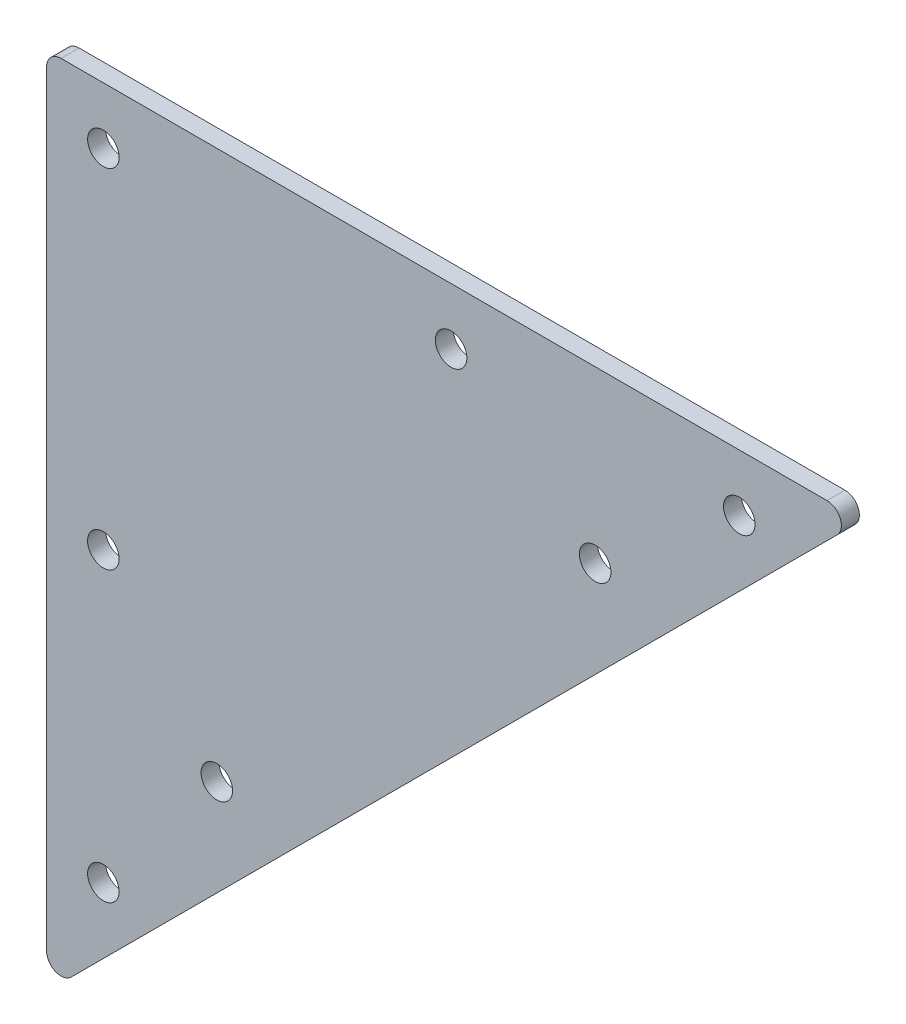
ISO-10303-21;
HEADER;
FILE_DESCRIPTION(('STEP AP214'),'2;1');
FILE_NAME('part.step','',(''),(''),'','','');
FILE_SCHEMA(('AUTOMOTIVE_DESIGN { 1 0 10303 214 1 1 1 1 }'));
ENDSEC;
DATA;
#1=APPLICATION_CONTEXT('core data for automotive mechanical design processes');
#2=APPLICATION_PROTOCOL_DEFINITION('international standard','automotive_design',2000,#1);
#3=PRODUCT_CONTEXT('',#1,'mechanical');
#4=PRODUCT('Part','Part','',(#3));
#5=PRODUCT_RELATED_PRODUCT_CATEGORY('part','',(#4));
#6=PRODUCT_DEFINITION_FORMATION('','',#4);
#7=PRODUCT_DEFINITION_CONTEXT('part definition',#1,'design');
#8=PRODUCT_DEFINITION('design','',#6,#7);
#9=PRODUCT_DEFINITION_SHAPE('','',#8);
#10=(LENGTH_UNIT() NAMED_UNIT(*) SI_UNIT(.MILLI.,.METRE.));
#11=(NAMED_UNIT(*) PLANE_ANGLE_UNIT() SI_UNIT($,.RADIAN.));
#12=(NAMED_UNIT(*) SI_UNIT($,.STERADIAN.) SOLID_ANGLE_UNIT());
#13=UNCERTAINTY_MEASURE_WITH_UNIT(LENGTH_MEASURE(1.E-05),#10,'distance_accuracy_value','');
#14=(GEOMETRIC_REPRESENTATION_CONTEXT(3) GLOBAL_UNCERTAINTY_ASSIGNED_CONTEXT((#13)) GLOBAL_UNIT_ASSIGNED_CONTEXT((#10,
#11,#12)) REPRESENTATION_CONTEXT('',''));
#15=CARTESIAN_POINT('',(0.,0.,0.));
#16=DIRECTION('',(0.,0.,1.));
#17=DIRECTION('',(1.,0.,0.));
#18=AXIS2_PLACEMENT_3D('',#15,#16,#17);
#19=CARTESIAN_POINT('',(-69.3020489685536,69.3020489685527,0.));
#20=DIRECTION('',(0.,0.,1.));
#21=DIRECTION('',(0.,-1.,0.));
#22=AXIS2_PLACEMENT_3D('',#19,#20,#21);
#23=PLANE('',#22);
#24=CARTESIAN_POINT('',(-41.8420489685458,-24.8520489685689,0.));
#25=DIRECTION('',(0.,0.,-1.));
#26=DIRECTION('',(0.,1.,0.));
#27=AXIS2_PLACEMENT_3D('',#24,#25,#26);
#28=CIRCLE('',#27,2.77876);
#29=CARTESIAN_POINT('',(-41.8420489685458,-22.0732889685689,0.));
#30=VERTEX_POINT('',#29);
#31=EDGE_CURVE('E161',#30,#30,#28,.F.);
#32=ORIENTED_EDGE('',*,*,#31,.T.);
#33=EDGE_LOOP('',(#32));
#34=FACE_BOUND('',#33,.T.);
#35=CARTESIAN_POINT('',(-61.8420489685541,0.547951031431015,0.));
#36=DIRECTION('',(0.,0.,-1.));
#37=DIRECTION('',(0.,1.,0.));
#38=AXIS2_PLACEMENT_3D('',#35,#36,#37);
#39=CIRCLE('',#38,2.77875999999999);
#40=CARTESIAN_POINT('',(-61.8420489685541,3.32671103143101,0.));
#41=VERTEX_POINT('',#40);
#42=EDGE_CURVE('E20',#41,#41,#39,.F.);
#43=ORIENTED_EDGE('',*,*,#42,.T.);
#44=EDGE_LOOP('',(#43));
#45=FACE_BOUND('',#44,.T.);
#46=CARTESIAN_POINT('',(24.852048968554,41.8420489685454,0.));
#47=DIRECTION('',(0.,0.,-1.));
#48=DIRECTION('',(0.,1.,0.));
#49=AXIS2_PLACEMENT_3D('',#46,#47,#48);
#50=CIRCLE('',#49,2.77876);
#51=CARTESIAN_POINT('',(24.852048968554,44.6208089685454,0.));
#52=VERTEX_POINT('',#51);
#53=EDGE_CURVE('E165',#52,#52,#50,.F.);
#54=ORIENTED_EDGE('',*,*,#53,.T.);
#55=EDGE_LOOP('',(#54));
#56=FACE_BOUND('',#55,.T.);
#57=CARTESIAN_POINT('',(-0.547951031445892,61.8420489685529,0.));
#58=DIRECTION('',(0.,0.,-1.));
#59=DIRECTION('',(0.,1.,0.));
#60=AXIS2_PLACEMENT_3D('',#57,#58,#59);
#61=CIRCLE('',#60,2.77876);
#62=CARTESIAN_POINT('',(-0.547951031445892,64.620808968553,0.));
#63=VERTEX_POINT('',#62);
#64=EDGE_CURVE('E180',#63,#63,#61,.F.);
#65=ORIENTED_EDGE('',*,*,#64,.T.);
#66=EDGE_LOOP('',(#65));
#67=FACE_BOUND('',#66,.T.);
#68=CARTESIAN_POINT('',(50.2520489685541,61.8420489685527,0.));
#69=DIRECTION('',(0.,0.,-1.));
#70=DIRECTION('',(0.,1.,0.));
#71=AXIS2_PLACEMENT_3D('',#68,#69,#70);
#72=CIRCLE('',#71,2.77876);
#73=CARTESIAN_POINT('',(50.2520489685541,64.6208089685527,0.));
#74=VERTEX_POINT('',#73);
#75=EDGE_CURVE('E111',#74,#74,#72,.F.);
#76=ORIENTED_EDGE('',*,*,#75,.T.);
#77=EDGE_LOOP('',(#76));
#78=FACE_BOUND('',#77,.T.);
#79=CARTESIAN_POINT('',(-61.8420489685532,-50.2520489685567,0.));
#80=DIRECTION('',(0.,0.,-1.));
#81=DIRECTION('',(0.,1.,0.));
#82=AXIS2_PLACEMENT_3D('',#79,#80,#81);
#83=CIRCLE('',#82,2.77875999999999);
#84=CARTESIAN_POINT('',(-61.8420489685532,-47.4732889685567,0.));
#85=VERTEX_POINT('',#84);
#86=EDGE_CURVE('E92',#85,#85,#83,.F.);
#87=ORIENTED_EDGE('',*,*,#86,.T.);
#88=EDGE_LOOP('',(#87));
#89=FACE_BOUND('',#88,.T.);
#90=CARTESIAN_POINT('',(-61.8420489685536,61.8420489685529,0.));
#91=DIRECTION('',(0.,0.,-1.));
#92=DIRECTION('',(0.,1.,0.));
#93=AXIS2_PLACEMENT_3D('',#90,#91,#92);
#94=CIRCLE('',#93,2.77875999999999);
#95=CARTESIAN_POINT('',(-61.8420489685536,64.6208089685529,0.));
#96=VERTEX_POINT('',#95);
#97=EDGE_CURVE('E105',#96,#96,#94,.F.);
#98=ORIENTED_EDGE('',*,*,#97,.T.);
#99=EDGE_LOOP('',(#98));
#100=FACE_BOUND('',#99,.T.);
#101=DIRECTION('',(1.,0.,0.));
#102=VECTOR('',#101,1.);
#103=CARTESIAN_POINT('',(-69.3020489685536,71.8420489685529,0.));
#104=LINE('',#103,#102);
#105=CARTESIAN_POINT('',(-69.3020489685536,71.8420489685529,0.));
#106=VERTEX_POINT('',#105);
#107=CARTESIAN_POINT('',(65.7099465201276,71.8420489685529,0.));
#108=VERTEX_POINT('',#107);
#109=EDGE_CURVE('E85',#106,#108,#104,.T.);
#110=ORIENTED_EDGE('',*,*,#109,.T.);
#111=CARTESIAN_POINT('',(65.7099465201275,69.3020489685529,0.));
#112=DIRECTION('',(0.,0.,-1.));
#113=DIRECTION('',(0.,1.,0.));
#114=AXIS2_PLACEMENT_3D('',#111,#112,#113);
#115=CIRCLE('',#114,2.54);
#116=CARTESIAN_POINT('',(67.5059977443414,67.5059977443391,0.));
#117=VERTEX_POINT('',#116);
#118=EDGE_CURVE('E120',#117,#108,#115,.F.);
#119=ORIENTED_EDGE('',*,*,#118,.F.);
#120=DIRECTION('',(-0.707106781186551,-0.707106781186544,0.));
#121=VECTOR('',#120,1.);
#122=CARTESIAN_POINT('',(67.5059977443414,67.5059977443392,0.));
#123=LINE('',#122,#121);
#124=CARTESIAN_POINT('',(-67.5059977443396,-67.5059977443403,0.));
#125=VERTEX_POINT('',#124);
#126=EDGE_CURVE('E116',#117,#125,#123,.T.);
#127=ORIENTED_EDGE('',*,*,#126,.T.);
#128=CARTESIAN_POINT('',(-69.3020489685532,-65.7099465201267,0.));
#129=DIRECTION('',(0.,0.,-1.));
#130=DIRECTION('',(0.,1.,0.));
#131=AXIS2_PLACEMENT_3D('',#128,#129,#130);
#132=CIRCLE('',#131,2.54);
#133=CARTESIAN_POINT('',(-71.8420489685534,-65.7099465201267,0.));
#134=VERTEX_POINT('',#133);
#135=EDGE_CURVE('E123',#134,#125,#132,.F.);
#136=ORIENTED_EDGE('',*,*,#135,.F.);
#137=DIRECTION('',(0.,1.,0.));
#138=VECTOR('',#137,1.);
#139=CARTESIAN_POINT('',(-71.8420489685536,69.3020489685527,0.));
#140=LINE('',#139,#138);
#141=CARTESIAN_POINT('',(-71.8420489685536,69.3020489685527,0.));
#142=VERTEX_POINT('',#141);
#143=EDGE_CURVE('E87',#134,#142,#140,.T.);
#144=ORIENTED_EDGE('',*,*,#143,.T.);
#145=CARTESIAN_POINT('',(-69.3020489685536,69.3020489685527,0.));
#146=DIRECTION('',(0.,0.,-1.));
#147=DIRECTION('',(0.,1.,0.));
#148=AXIS2_PLACEMENT_3D('',#145,#146,#147);
#149=CIRCLE('',#148,2.54);
#150=EDGE_CURVE('E82',#106,#142,#149,.F.);
#151=ORIENTED_EDGE('',*,*,#150,.F.);
#152=EDGE_LOOP('',(#110,#119,#127,#136,#144,#151));
#153=FACE_BOUND('',#152,.T.);
#154=ADVANCED_FACE('F17',(#34,#45,#56,#67,#78,#89,#100,#153),#23,.F.);
#155=CARTESIAN_POINT('',(-61.8420489685541,0.547951031431015,3.17499999999993));
#156=DIRECTION('',(0.,0.,-1.));
#157=DIRECTION('',(0.,1.,0.));
#158=AXIS2_PLACEMENT_3D('',#155,#156,#157);
#159=CYLINDRICAL_SURFACE('',#158,2.77875999999999);
#160=CARTESIAN_POINT('',(-61.8420489685541,0.547951031431015,3.17499999999993));
#161=DIRECTION('',(0.,0.,-1.));
#162=DIRECTION('',(0.,1.,0.));
#163=AXIS2_PLACEMENT_3D('',#160,#161,#162);
#164=CIRCLE('',#163,2.77875999999999);
#165=CARTESIAN_POINT('',(-61.8420489685541,3.32671103143101,3.17499999999993));
#166=VERTEX_POINT('',#165);
#167=EDGE_CURVE('E157',#166,#166,#164,.T.);
#168=ORIENTED_EDGE('',*,*,#167,.F.);
#169=EDGE_LOOP('',(#168));
#170=FACE_BOUND('',#169,.T.);
#171=ORIENTED_EDGE('',*,*,#42,.F.);
#172=EDGE_LOOP('',(#171));
#173=FACE_BOUND('',#172,.T.);
#174=ADVANCED_FACE('F191',(#170,#173),#159,.F.);
#175=CARTESIAN_POINT('',(-0.547951031445892,61.8420489685529,3.17499999999993));
#176=DIRECTION('',(0.,0.,-1.));
#177=DIRECTION('',(0.,1.,0.));
#178=AXIS2_PLACEMENT_3D('',#175,#176,#177);
#179=CYLINDRICAL_SURFACE('',#178,2.77876);
#180=CARTESIAN_POINT('',(-0.547951031445892,61.8420489685529,3.17499999999993));
#181=DIRECTION('',(0.,0.,-1.));
#182=DIRECTION('',(0.,1.,0.));
#183=AXIS2_PLACEMENT_3D('',#180,#181,#182);
#184=CIRCLE('',#183,2.77876);
#185=CARTESIAN_POINT('',(-0.547951031445892,64.620808968553,3.17499999999993));
#186=VERTEX_POINT('',#185);
#187=EDGE_CURVE('E153',#186,#186,#184,.T.);
#188=ORIENTED_EDGE('',*,*,#187,.F.);
#189=EDGE_LOOP('',(#188));
#190=FACE_BOUND('',#189,.T.);
#191=ORIENTED_EDGE('',*,*,#64,.F.);
#192=EDGE_LOOP('',(#191));
#193=FACE_BOUND('',#192,.T.);
#194=ADVANCED_FACE('F193',(#190,#193),#179,.F.);
#195=CARTESIAN_POINT('',(-61.8420489685532,-50.2520489685567,3.17499999999993));
#196=DIRECTION('',(0.,0.,-1.));
#197=DIRECTION('',(0.,1.,0.));
#198=AXIS2_PLACEMENT_3D('',#195,#196,#197);
#199=CYLINDRICAL_SURFACE('',#198,2.77875999999999);
#200=CARTESIAN_POINT('',(-61.8420489685532,-50.2520489685567,3.17499999999993));
#201=DIRECTION('',(0.,0.,-1.));
#202=DIRECTION('',(0.,1.,0.));
#203=AXIS2_PLACEMENT_3D('',#200,#201,#202);
#204=CIRCLE('',#203,2.77875999999999);
#205=CARTESIAN_POINT('',(-61.8420489685532,-47.4732889685567,3.17499999999993));
#206=VERTEX_POINT('',#205);
#207=EDGE_CURVE('E149',#206,#206,#204,.T.);
#208=ORIENTED_EDGE('',*,*,#207,.F.);
#209=EDGE_LOOP('',(#208));
#210=FACE_BOUND('',#209,.T.);
#211=ORIENTED_EDGE('',*,*,#86,.F.);
#212=EDGE_LOOP('',(#211));
#213=FACE_BOUND('',#212,.T.);
#214=ADVANCED_FACE('F200',(#210,#213),#199,.F.);
#215=CARTESIAN_POINT('',(-69.3020489685536,69.3020489685527,3.17499999999993));
#216=DIRECTION('',(0.,0.,-1.));
#217=DIRECTION('',(0.,1.,0.));
#218=AXIS2_PLACEMENT_3D('',#215,#216,#217);
#219=CYLINDRICAL_SURFACE('',#218,2.54);
#220=CARTESIAN_POINT('',(-69.3020489685536,69.3020489685527,3.17499999999993));
#221=DIRECTION('',(0.,0.,-1.));
#222=DIRECTION('',(0.,1.,0.));
#223=AXIS2_PLACEMENT_3D('',#220,#221,#222);
#224=CIRCLE('',#223,2.54);
#225=CARTESIAN_POINT('',(-69.3020489685536,71.8420489685529,3.17499999999993));
#226=VERTEX_POINT('',#225);
#227=CARTESIAN_POINT('',(-71.8420489685536,69.3020489685527,3.17499999999993));
#228=VERTEX_POINT('',#227);
#229=EDGE_CURVE('E98',#226,#228,#224,.F.);
#230=ORIENTED_EDGE('',*,*,#229,.F.);
#231=DIRECTION('',(0.,0.,-1.));
#232=VECTOR('',#231,1.);
#233=CARTESIAN_POINT('',(-69.3020489685536,71.8420489685529,3.17499999999993));
#234=LINE('',#233,#232);
#235=EDGE_CURVE('E95',#226,#106,#234,.T.);
#236=ORIENTED_EDGE('',*,*,#235,.T.);
#237=ORIENTED_EDGE('',*,*,#150,.T.);
#238=DIRECTION('',(0.,0.,1.));
#239=VECTOR('',#238,1.);
#240=CARTESIAN_POINT('',(-71.8420489685536,69.3020489685527,3.17499999999993));
#241=LINE('',#240,#239);
#242=EDGE_CURVE('E91',#142,#228,#241,.T.);
#243=ORIENTED_EDGE('',*,*,#242,.T.);
#244=EDGE_LOOP('',(#230,#236,#237,#243));
#245=FACE_BOUND('',#244,.T.);
#246=ADVANCED_FACE('F96',(#245),#219,.T.);
#247=CARTESIAN_POINT('',(-71.8420489685536,69.3020489685527,3.17499999999993));
#248=DIRECTION('',(1.,0.,0.));
#249=DIRECTION('',(0.,1.,0.));
#250=AXIS2_PLACEMENT_3D('',#247,#248,#249);
#251=PLANE('',#250);
#252=DIRECTION('',(0.,0.,-1.));
#253=VECTOR('',#252,1.);
#254=CARTESIAN_POINT('',(-71.8420489685532,-65.7099465201267,3.17499999999993));
#255=LINE('',#254,#253);
#256=CARTESIAN_POINT('',(-71.8420489685534,-65.7099465201267,3.17499999999993));
#257=VERTEX_POINT('',#256);
#258=EDGE_CURVE('E176',#257,#134,#255,.T.);
#259=ORIENTED_EDGE('',*,*,#258,.F.);
#260=DIRECTION('',(0.,-1.,0.));
#261=VECTOR('',#260,1.);
#262=CARTESIAN_POINT('',(-71.8420489685536,69.3020489685527,3.17499999999993));
#263=LINE('',#262,#261);
#264=EDGE_CURVE('E146',#228,#257,#263,.T.);
#265=ORIENTED_EDGE('',*,*,#264,.F.);
#266=ORIENTED_EDGE('',*,*,#242,.F.);
#267=ORIENTED_EDGE('',*,*,#143,.F.);
#268=EDGE_LOOP('',(#259,#265,#266,#267));
#269=FACE_BOUND('',#268,.T.);
#270=ADVANCED_FACE('F241',(#269),#251,.F.);
#271=CARTESIAN_POINT('',(-69.3020489685532,-65.7099465201267,3.17499999999993));
#272=DIRECTION('',(0.,0.,-1.));
#273=DIRECTION('',(0.,1.,0.));
#274=AXIS2_PLACEMENT_3D('',#271,#272,#273);
#275=CYLINDRICAL_SURFACE('',#274,2.54);
#276=CARTESIAN_POINT('',(-69.3020489685532,-65.7099465201267,3.17499999999993));
#277=DIRECTION('',(0.,0.,-1.));
#278=DIRECTION('',(0.,1.,0.));
#279=AXIS2_PLACEMENT_3D('',#276,#277,#278);
#280=CIRCLE('',#279,2.54);
#281=CARTESIAN_POINT('',(-67.5059977443395,-67.5059977443405,3.17499999999993));
#282=VERTEX_POINT('',#281);
#283=EDGE_CURVE('E142',#257,#282,#280,.F.);
#284=ORIENTED_EDGE('',*,*,#283,.F.);
#285=ORIENTED_EDGE('',*,*,#258,.T.);
#286=ORIENTED_EDGE('',*,*,#135,.T.);
#287=DIRECTION('',(0.,0.,1.));
#288=VECTOR('',#287,1.);
#289=CARTESIAN_POINT('',(-67.5059977443396,-67.5059977443403,3.17499999999993));
#290=LINE('',#289,#288);
#291=EDGE_CURVE('E121',#125,#282,#290,.T.);
#292=ORIENTED_EDGE('',*,*,#291,.T.);
#293=EDGE_LOOP('',(#284,#285,#286,#292));
#294=FACE_BOUND('',#293,.T.);
#295=ADVANCED_FACE('F237',(#294),#275,.T.);
#296=CARTESIAN_POINT('',(67.5059977443414,67.5059977443392,3.17499999999993));
#297=DIRECTION('',(-0.707106781186544,0.707106781186551,0.));
#298=DIRECTION('',(-0.707106781186551,-0.707106781186544,0.));
#299=AXIS2_PLACEMENT_3D('',#296,#297,#298);
#300=PLANE('',#299);
#301=DIRECTION('',(0.,0.,-1.));
#302=VECTOR('',#301,1.);
#303=CARTESIAN_POINT('',(67.5059977443415,67.5059977443391,3.17499999999993));
#304=LINE('',#303,#302);
#305=CARTESIAN_POINT('',(67.5059977443414,67.5059977443391,3.17499999999993));
#306=VERTEX_POINT('',#305);
#307=EDGE_CURVE('E174',#306,#117,#304,.T.);
#308=ORIENTED_EDGE('',*,*,#307,.F.);
#309=DIRECTION('',(0.70710678118655,0.707106781186545,0.));
#310=VECTOR('',#309,1.);
#311=CARTESIAN_POINT('',(-67.5059977443393,-67.5059977443406,3.17499999999994));
#312=LINE('',#311,#310);
#313=EDGE_CURVE('E141',#282,#306,#312,.T.);
#314=ORIENTED_EDGE('',*,*,#313,.F.);
#315=ORIENTED_EDGE('',*,*,#291,.F.);
#316=ORIENTED_EDGE('',*,*,#126,.F.);
#317=EDGE_LOOP('',(#308,#314,#315,#316));
#318=FACE_BOUND('',#317,.T.);
#319=ADVANCED_FACE('F234',(#318),#300,.F.);
#320=CARTESIAN_POINT('',(65.7099465201275,69.3020489685529,3.17499999999993));
#321=DIRECTION('',(0.,0.,-1.));
#322=DIRECTION('',(0.,1.,0.));
#323=AXIS2_PLACEMENT_3D('',#320,#321,#322);
#324=CYLINDRICAL_SURFACE('',#323,2.54);
#325=CARTESIAN_POINT('',(65.7099465201275,69.3020489685529,3.17499999999993));
#326=DIRECTION('',(0.,0.,-1.));
#327=DIRECTION('',(0.,1.,0.));
#328=AXIS2_PLACEMENT_3D('',#325,#326,#327);
#329=CIRCLE('',#328,2.54);
#330=CARTESIAN_POINT('',(65.7099465201276,71.8420489685529,3.17499999999993));
#331=VERTEX_POINT('',#330);
#332=EDGE_CURVE('E137',#306,#331,#329,.F.);
#333=ORIENTED_EDGE('',*,*,#332,.F.);
#334=ORIENTED_EDGE('',*,*,#307,.T.);
#335=ORIENTED_EDGE('',*,*,#118,.T.);
#336=DIRECTION('',(0.,0.,-1.));
#337=VECTOR('',#336,1.);
#338=CARTESIAN_POINT('',(65.7099465201276,71.8420489685529,3.17499999999993));
#339=LINE('',#338,#337);
#340=EDGE_CURVE('E40',#108,#331,#339,.F.);
#341=ORIENTED_EDGE('',*,*,#340,.T.);
#342=EDGE_LOOP('',(#333,#334,#335,#341));
#343=FACE_BOUND('',#342,.T.);
#344=ADVANCED_FACE('F231',(#343),#324,.T.);
#345=CARTESIAN_POINT('',(-69.3020489685536,71.8420489685529,3.17499999999993));
#346=DIRECTION('',(0.,-1.,0.));
#347=DIRECTION('',(0.,0.,-1.));
#348=AXIS2_PLACEMENT_3D('',#345,#346,#347);
#349=PLANE('',#348);
#350=ORIENTED_EDGE('',*,*,#235,.F.);
#351=DIRECTION('',(1.,0.,0.));
#352=VECTOR('',#351,1.);
#353=CARTESIAN_POINT('',(-69.3020489685536,71.8420489685528,3.17499999999993));
#354=LINE('',#353,#352);
#355=EDGE_CURVE('E136',#331,#226,#354,.F.);
#356=ORIENTED_EDGE('',*,*,#355,.F.);
#357=ORIENTED_EDGE('',*,*,#340,.F.);
#358=ORIENTED_EDGE('',*,*,#109,.F.);
#359=EDGE_LOOP('',(#350,#356,#357,#358));
#360=FACE_BOUND('',#359,.T.);
#361=ADVANCED_FACE('F103',(#360),#349,.F.);
#362=CARTESIAN_POINT('',(-61.8420489685536,61.8420489685529,3.17499999999993));
#363=DIRECTION('',(0.,0.,-1.));
#364=DIRECTION('',(0.,1.,0.));
#365=AXIS2_PLACEMENT_3D('',#362,#363,#364);
#366=CYLINDRICAL_SURFACE('',#365,2.77875999999999);
#367=CARTESIAN_POINT('',(-61.8420489685536,61.8420489685529,3.17499999999993));
#368=DIRECTION('',(0.,0.,-1.));
#369=DIRECTION('',(0.,1.,0.));
#370=AXIS2_PLACEMENT_3D('',#367,#368,#369);
#371=CIRCLE('',#370,2.77875999999999);
#372=CARTESIAN_POINT('',(-61.8420489685536,64.6208089685529,3.17499999999993));
#373=VERTEX_POINT('',#372);
#374=EDGE_CURVE('E132',#373,#373,#371,.T.);
#375=ORIENTED_EDGE('',*,*,#374,.F.);
#376=EDGE_LOOP('',(#375));
#377=FACE_BOUND('',#376,.T.);
#378=ORIENTED_EDGE('',*,*,#97,.F.);
#379=EDGE_LOOP('',(#378));
#380=FACE_BOUND('',#379,.T.);
#381=ADVANCED_FACE('F224',(#377,#380),#366,.F.);
#382=CARTESIAN_POINT('',(50.2520489685541,61.8420489685527,3.17499999999993));
#383=DIRECTION('',(0.,0.,-1.));
#384=DIRECTION('',(0.,1.,0.));
#385=AXIS2_PLACEMENT_3D('',#382,#383,#384);
#386=CYLINDRICAL_SURFACE('',#385,2.77876);
#387=CARTESIAN_POINT('',(50.2520489685541,61.8420489685527,3.17499999999993));
#388=DIRECTION('',(0.,0.,-1.));
#389=DIRECTION('',(0.,1.,0.));
#390=AXIS2_PLACEMENT_3D('',#387,#388,#389);
#391=CIRCLE('',#390,2.77876);
#392=CARTESIAN_POINT('',(50.2520489685541,64.6208089685527,3.17499999999993));
#393=VERTEX_POINT('',#392);
#394=EDGE_CURVE('E128',#393,#393,#391,.T.);
#395=ORIENTED_EDGE('',*,*,#394,.F.);
#396=EDGE_LOOP('',(#395));
#397=FACE_BOUND('',#396,.T.);
#398=ORIENTED_EDGE('',*,*,#75,.F.);
#399=EDGE_LOOP('',(#398));
#400=FACE_BOUND('',#399,.T.);
#401=ADVANCED_FACE('F220',(#397,#400),#386,.F.);
#402=CARTESIAN_POINT('',(24.852048968554,41.8420489685454,3.17499999999993));
#403=DIRECTION('',(0.,0.,-1.));
#404=DIRECTION('',(0.,1.,0.));
#405=AXIS2_PLACEMENT_3D('',#402,#403,#404);
#406=CYLINDRICAL_SURFACE('',#405,2.77876);
#407=CARTESIAN_POINT('',(24.852048968554,41.8420489685454,3.17499999999993));
#408=DIRECTION('',(0.,0.,-1.));
#409=DIRECTION('',(0.,1.,0.));
#410=AXIS2_PLACEMENT_3D('',#407,#408,#409);
#411=CIRCLE('',#410,2.77876);
#412=CARTESIAN_POINT('',(24.852048968554,44.6208089685454,3.17499999999993));
#413=VERTEX_POINT('',#412);
#414=EDGE_CURVE('E27',#413,#413,#411,.T.);
#415=ORIENTED_EDGE('',*,*,#414,.F.);
#416=EDGE_LOOP('',(#415));
#417=FACE_BOUND('',#416,.T.);
#418=ORIENTED_EDGE('',*,*,#53,.F.);
#419=EDGE_LOOP('',(#418));
#420=FACE_BOUND('',#419,.T.);
#421=ADVANCED_FACE('F213',(#417,#420),#406,.F.);
#422=CARTESIAN_POINT('',(-41.8420489685458,-24.8520489685689,3.17499999999993));
#423=DIRECTION('',(0.,0.,-1.));
#424=DIRECTION('',(0.,1.,0.));
#425=AXIS2_PLACEMENT_3D('',#422,#423,#424);
#426=CYLINDRICAL_SURFACE('',#425,2.77876);
#427=CARTESIAN_POINT('',(-41.8420489685458,-24.8520489685689,3.17499999999993));
#428=DIRECTION('',(0.,0.,-1.));
#429=DIRECTION('',(0.,1.,0.));
#430=AXIS2_PLACEMENT_3D('',#427,#428,#429);
#431=CIRCLE('',#430,2.77876);
#432=CARTESIAN_POINT('',(-41.8420489685458,-22.0732889685689,3.17499999999993));
#433=VERTEX_POINT('',#432);
#434=EDGE_CURVE('E11',#433,#433,#431,.T.);
#435=ORIENTED_EDGE('',*,*,#434,.F.);
#436=EDGE_LOOP('',(#435));
#437=FACE_BOUND('',#436,.T.);
#438=ORIENTED_EDGE('',*,*,#31,.F.);
#439=EDGE_LOOP('',(#438));
#440=FACE_BOUND('',#439,.T.);
#441=ADVANCED_FACE('F207',(#437,#440),#426,.F.);
#442=CARTESIAN_POINT('',(-69.3020489685536,69.3020489685527,3.17499999999993));
#443=DIRECTION('',(0.,0.,1.));
#444=DIRECTION('',(0.,-1.,0.));
#445=AXIS2_PLACEMENT_3D('',#442,#443,#444);
#446=PLANE('',#445);
#447=ORIENTED_EDGE('',*,*,#434,.T.);
#448=EDGE_LOOP('',(#447));
#449=FACE_BOUND('',#448,.T.);
#450=ORIENTED_EDGE('',*,*,#414,.T.);
#451=EDGE_LOOP('',(#450));
#452=FACE_BOUND('',#451,.T.);
#453=ORIENTED_EDGE('',*,*,#394,.T.);
#454=EDGE_LOOP('',(#453));
#455=FACE_BOUND('',#454,.T.);
#456=ORIENTED_EDGE('',*,*,#374,.T.);
#457=EDGE_LOOP('',(#456));
#458=FACE_BOUND('',#457,.T.);
#459=ORIENTED_EDGE('',*,*,#332,.T.);
#460=ORIENTED_EDGE('',*,*,#355,.T.);
#461=ORIENTED_EDGE('',*,*,#229,.T.);
#462=ORIENTED_EDGE('',*,*,#264,.T.);
#463=ORIENTED_EDGE('',*,*,#283,.T.);
#464=ORIENTED_EDGE('',*,*,#313,.T.);
#465=EDGE_LOOP('',(#459,#460,#461,#462,#463,#464));
#466=FACE_BOUND('',#465,.T.);
#467=ORIENTED_EDGE('',*,*,#207,.T.);
#468=EDGE_LOOP('',(#467));
#469=FACE_BOUND('',#468,.T.);
#470=ORIENTED_EDGE('',*,*,#187,.T.);
#471=EDGE_LOOP('',(#470));
#472=FACE_BOUND('',#471,.T.);
#473=ORIENTED_EDGE('',*,*,#167,.T.);
#474=EDGE_LOOP('',(#473));
#475=FACE_BOUND('',#474,.T.);
#476=ADVANCED_FACE('F205',(#449,#452,#455,#458,#466,#469,#472,#475),#446,.T.);
#477=CLOSED_SHELL('',(#154,#174,#194,#214,#246,#270,#295,#319,#344,#361,#381,#401,#421,#441,#476));
#478=MANIFOLD_SOLID_BREP('B1',#477);
#479=ADVANCED_BREP_SHAPE_REPRESENTATION('',(#18,#478),#14);
#480=SHAPE_DEFINITION_REPRESENTATION(#9,#479);
ENDSEC;
END-ISO-10303-21;
